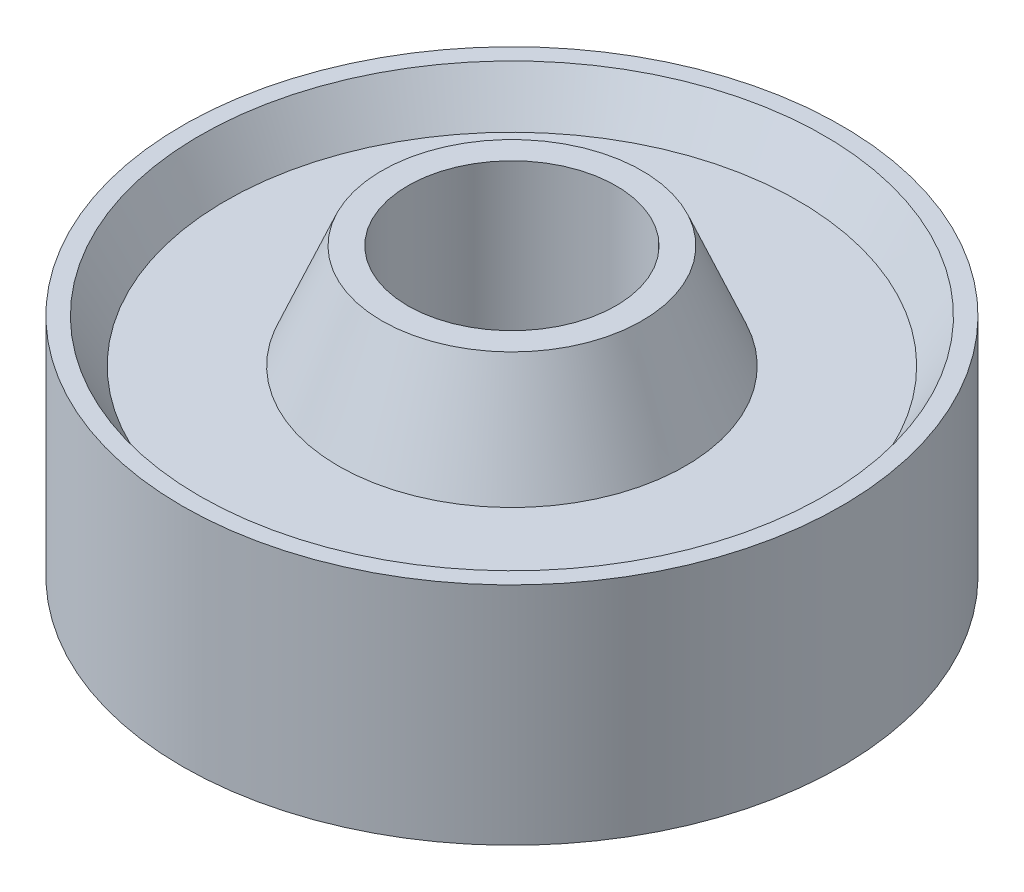
ISO-10303-21;
HEADER;
FILE_DESCRIPTION(('STEP AP214'),'2;1');
FILE_NAME('part.step','',(''),(''),'','','');
FILE_SCHEMA(('AUTOMOTIVE_DESIGN { 1 0 10303 214 1 1 1 1 }'));
ENDSEC;
DATA;
#1=APPLICATION_CONTEXT('core data for automotive mechanical design processes');
#2=APPLICATION_PROTOCOL_DEFINITION('international standard','automotive_design',2000,#1);
#3=PRODUCT_CONTEXT('',#1,'mechanical');
#4=PRODUCT('Part','Part','',(#3));
#5=PRODUCT_RELATED_PRODUCT_CATEGORY('part','',(#4));
#6=PRODUCT_DEFINITION_FORMATION('','',#4);
#7=PRODUCT_DEFINITION_CONTEXT('part definition',#1,'design');
#8=PRODUCT_DEFINITION('design','',#6,#7);
#9=PRODUCT_DEFINITION_SHAPE('','',#8);
#10=(LENGTH_UNIT() NAMED_UNIT(*) SI_UNIT(.MILLI.,.METRE.));
#11=(NAMED_UNIT(*) PLANE_ANGLE_UNIT() SI_UNIT($,.RADIAN.));
#12=(NAMED_UNIT(*) SI_UNIT($,.STERADIAN.) SOLID_ANGLE_UNIT());
#13=UNCERTAINTY_MEASURE_WITH_UNIT(LENGTH_MEASURE(1.E-05),#10,'distance_accuracy_value','');
#14=(GEOMETRIC_REPRESENTATION_CONTEXT(3) GLOBAL_UNCERTAINTY_ASSIGNED_CONTEXT((#13)) GLOBAL_UNIT_ASSIGNED_CONTEXT((#10,
#11,#12)) REPRESENTATION_CONTEXT('',''));
#15=CARTESIAN_POINT('',(0.,0.,0.));
#16=DIRECTION('',(0.,0.,1.));
#17=DIRECTION('',(1.,0.,0.));
#18=AXIS2_PLACEMENT_3D('',#15,#16,#17);
#19=CARTESIAN_POINT('',(0.,-20.,0.));
#20=DIRECTION('',(0.,1.,0.));
#21=DIRECTION('',(0.,0.,1.));
#22=AXIS2_PLACEMENT_3D('',#19,#20,#21);
#23=PLANE('',#22);
#24=CARTESIAN_POINT('',(0.,-20.,0.));
#25=DIRECTION('',(0.,1.,0.));
#26=DIRECTION('',(0.,0.,1.));
#27=AXIS2_PLACEMENT_3D('',#24,#25,#26);
#28=CIRCLE('',#27,12.);
#29=CARTESIAN_POINT('',(0.,-20.,12.));
#30=VERTEX_POINT('',#29);
#31=EDGE_CURVE('E88',#30,#30,#28,.T.);
#32=ORIENTED_EDGE('',*,*,#31,.T.);
#33=EDGE_LOOP('',(#32));
#34=FACE_BOUND('',#33,.T.);
#35=CARTESIAN_POINT('',(0.,-20.,0.));
#36=DIRECTION('',(0.,1.,0.));
#37=DIRECTION('',(0.,0.,1.));
#38=AXIS2_PLACEMENT_3D('',#35,#36,#37);
#39=CIRCLE('',#38,15.);
#40=CARTESIAN_POINT('',(0.,-20.,15.));
#41=VERTEX_POINT('',#40);
#42=EDGE_CURVE('E10',#41,#41,#39,.T.);
#43=ORIENTED_EDGE('',*,*,#42,.F.);
#44=EDGE_LOOP('',(#43));
#45=FACE_BOUND('',#44,.T.);
#46=ADVANCED_FACE('F41',(#34,#45),#23,.F.);
#47=CARTESIAN_POINT('',(0.,-20.,0.));
#48=DIRECTION('',(0.,1.,0.));
#49=DIRECTION('',(0.,0.,1.));
#50=AXIS2_PLACEMENT_3D('',#47,#48,#49);
#51=CONICAL_SURFACE('',#50,15.,0.394791119699761);
#52=CARTESIAN_POINT('',(0.,-8.,0.));
#53=DIRECTION('',(0.,1.,0.));
#54=DIRECTION('',(0.,0.,1.));
#55=AXIS2_PLACEMENT_3D('',#52,#53,#54);
#56=CIRCLE('',#55,20.);
#57=CARTESIAN_POINT('',(0.,-8.,20.));
#58=VERTEX_POINT('',#57);
#59=EDGE_CURVE('E48',#58,#58,#56,.T.);
#60=ORIENTED_EDGE('',*,*,#59,.F.);
#61=EDGE_LOOP('',(#60));
#62=FACE_BOUND('',#61,.T.);
#63=ORIENTED_EDGE('',*,*,#42,.T.);
#64=EDGE_LOOP('',(#63));
#65=FACE_BOUND('',#64,.T.);
#66=ADVANCED_FACE('F155',(#62,#65),#51,.T.);
#67=CARTESIAN_POINT('',(20.,-8.,0.));
#68=DIRECTION('',(0.,1.,0.));
#69=DIRECTION('',(0.,0.,1.));
#70=AXIS2_PLACEMENT_3D('',#67,#68,#69);
#71=PLANE('',#70);
#72=CARTESIAN_POINT('',(0.,-8.,0.));
#73=DIRECTION('',(0.,1.,0.));
#74=DIRECTION('',(0.,0.,1.));
#75=AXIS2_PLACEMENT_3D('',#72,#73,#74);
#76=CIRCLE('',#75,33.);
#77=CARTESIAN_POINT('',(0.,-8.,33.));
#78=VERTEX_POINT('',#77);
#79=EDGE_CURVE('E53',#78,#78,#76,.T.);
#80=ORIENTED_EDGE('',*,*,#79,.F.);
#81=EDGE_LOOP('',(#80));
#82=FACE_BOUND('',#81,.T.);
#83=ORIENTED_EDGE('',*,*,#59,.T.);
#84=EDGE_LOOP('',(#83));
#85=FACE_BOUND('',#84,.T.);
#86=ADVANCED_FACE('F150',(#82,#85),#71,.F.);
#87=CARTESIAN_POINT('',(0.,-8.,0.));
#88=DIRECTION('',(0.,-1.,0.));
#89=DIRECTION('',(0.,0.,-1.));
#90=AXIS2_PLACEMENT_3D('',#87,#88,#89);
#91=CONICAL_SURFACE('',#90,33.,0.540419500270584);
#92=CARTESIAN_POINT('',(0.,-13.,0.));
#93=DIRECTION('',(0.,1.,0.));
#94=DIRECTION('',(0.,0.,1.));
#95=AXIS2_PLACEMENT_3D('',#92,#93,#94);
#96=CIRCLE('',#95,36.);
#97=CARTESIAN_POINT('',(0.,-13.,36.));
#98=VERTEX_POINT('',#97);
#99=EDGE_CURVE('E58',#98,#98,#96,.T.);
#100=ORIENTED_EDGE('',*,*,#99,.F.);
#101=EDGE_LOOP('',(#100));
#102=FACE_BOUND('',#101,.T.);
#103=ORIENTED_EDGE('',*,*,#79,.T.);
#104=EDGE_LOOP('',(#103));
#105=FACE_BOUND('',#104,.T.);
#106=ADVANCED_FACE('F144',(#102,#105),#91,.F.);
#107=CARTESIAN_POINT('',(36.,-13.,0.));
#108=DIRECTION('',(0.,1.,0.));
#109=DIRECTION('',(0.,0.,1.));
#110=AXIS2_PLACEMENT_3D('',#107,#108,#109);
#111=PLANE('',#110);
#112=CARTESIAN_POINT('',(0.,-13.,0.));
#113=DIRECTION('',(0.,1.,0.));
#114=DIRECTION('',(0.,0.,1.));
#115=AXIS2_PLACEMENT_3D('',#112,#113,#114);
#116=CIRCLE('',#115,38.);
#117=CARTESIAN_POINT('',(0.,-13.,38.));
#118=VERTEX_POINT('',#117);
#119=EDGE_CURVE('E64',#118,#118,#116,.T.);
#120=ORIENTED_EDGE('',*,*,#119,.F.);
#121=EDGE_LOOP('',(#120));
#122=FACE_BOUND('',#121,.T.);
#123=ORIENTED_EDGE('',*,*,#99,.T.);
#124=EDGE_LOOP('',(#123));
#125=FACE_BOUND('',#124,.T.);
#126=ADVANCED_FACE('F138',(#122,#125),#111,.F.);
#127=CARTESIAN_POINT('',(0.,20.,0.));
#128=DIRECTION('',(0.,1.,0.));
#129=DIRECTION('',(0.,0.,1.));
#130=AXIS2_PLACEMENT_3D('',#127,#128,#129);
#131=CYLINDRICAL_SURFACE('',#130,38.);
#132=CARTESIAN_POINT('',(0.,13.,0.));
#133=DIRECTION('',(0.,1.,0.));
#134=DIRECTION('',(0.,0.,1.));
#135=AXIS2_PLACEMENT_3D('',#132,#133,#134);
#136=CIRCLE('',#135,38.);
#137=CARTESIAN_POINT('',(0.,13.,38.));
#138=VERTEX_POINT('',#137);
#139=EDGE_CURVE('E68',#138,#138,#136,.T.);
#140=ORIENTED_EDGE('',*,*,#139,.F.);
#141=EDGE_LOOP('',(#140));
#142=FACE_BOUND('',#141,.T.);
#143=ORIENTED_EDGE('',*,*,#119,.T.);
#144=EDGE_LOOP('',(#143));
#145=FACE_BOUND('',#144,.T.);
#146=ADVANCED_FACE('F132',(#142,#145),#131,.T.);
#147=CARTESIAN_POINT('',(36.,13.,0.));
#148=DIRECTION('',(0.,-1.,0.));
#149=DIRECTION('',(0.,0.,-1.));
#150=AXIS2_PLACEMENT_3D('',#147,#148,#149);
#151=PLANE('',#150);
#152=CARTESIAN_POINT('',(0.,13.,0.));
#153=DIRECTION('',(0.,1.,0.));
#154=DIRECTION('',(0.,0.,1.));
#155=AXIS2_PLACEMENT_3D('',#152,#153,#154);
#156=CIRCLE('',#155,36.);
#157=CARTESIAN_POINT('',(0.,13.,36.));
#158=VERTEX_POINT('',#157);
#159=EDGE_CURVE('E72',#158,#158,#156,.T.);
#160=ORIENTED_EDGE('',*,*,#159,.F.);
#161=EDGE_LOOP('',(#160));
#162=FACE_BOUND('',#161,.T.);
#163=ORIENTED_EDGE('',*,*,#139,.T.);
#164=EDGE_LOOP('',(#163));
#165=FACE_BOUND('',#164,.T.);
#166=ADVANCED_FACE('F126',(#162,#165),#151,.F.);
#167=CARTESIAN_POINT('',(0.,13.,0.));
#168=DIRECTION('',(0.,1.,0.));
#169=DIRECTION('',(0.,0.,1.));
#170=AXIS2_PLACEMENT_3D('',#167,#168,#169);
#171=CONICAL_SURFACE('',#170,36.,0.540419500270585);
#172=CARTESIAN_POINT('',(0.,8.,0.));
#173=DIRECTION('',(0.,1.,0.));
#174=DIRECTION('',(0.,0.,1.));
#175=AXIS2_PLACEMENT_3D('',#172,#173,#174);
#176=CIRCLE('',#175,33.);
#177=CARTESIAN_POINT('',(0.,8.,33.));
#178=VERTEX_POINT('',#177);
#179=EDGE_CURVE('E76',#178,#178,#176,.T.);
#180=ORIENTED_EDGE('',*,*,#179,.F.);
#181=EDGE_LOOP('',(#180));
#182=FACE_BOUND('',#181,.T.);
#183=ORIENTED_EDGE('',*,*,#159,.T.);
#184=EDGE_LOOP('',(#183));
#185=FACE_BOUND('',#184,.T.);
#186=ADVANCED_FACE('F120',(#182,#185),#171,.F.);
#187=CARTESIAN_POINT('',(20.,8.,0.));
#188=DIRECTION('',(0.,-1.,0.));
#189=DIRECTION('',(0.,0.,-1.));
#190=AXIS2_PLACEMENT_3D('',#187,#188,#189);
#191=PLANE('',#190);
#192=CARTESIAN_POINT('',(0.,8.,0.));
#193=DIRECTION('',(0.,1.,0.));
#194=DIRECTION('',(0.,0.,1.));
#195=AXIS2_PLACEMENT_3D('',#192,#193,#194);
#196=CIRCLE('',#195,20.);
#197=CARTESIAN_POINT('',(0.,8.,20.));
#198=VERTEX_POINT('',#197);
#199=EDGE_CURVE('E80',#198,#198,#196,.T.);
#200=ORIENTED_EDGE('',*,*,#199,.F.);
#201=EDGE_LOOP('',(#200));
#202=FACE_BOUND('',#201,.T.);
#203=ORIENTED_EDGE('',*,*,#179,.T.);
#204=EDGE_LOOP('',(#203));
#205=FACE_BOUND('',#204,.T.);
#206=ADVANCED_FACE('F114',(#202,#205),#191,.F.);
#207=CARTESIAN_POINT('',(0.,8.,0.));
#208=DIRECTION('',(0.,-1.,0.));
#209=DIRECTION('',(0.,0.,-1.));
#210=AXIS2_PLACEMENT_3D('',#207,#208,#209);
#211=CONICAL_SURFACE('',#210,20.,0.394791119699761);
#212=CARTESIAN_POINT('',(0.,20.,0.));
#213=DIRECTION('',(0.,1.,0.));
#214=DIRECTION('',(0.,0.,1.));
#215=AXIS2_PLACEMENT_3D('',#212,#213,#214);
#216=CIRCLE('',#215,15.);
#217=CARTESIAN_POINT('',(0.,20.,15.));
#218=VERTEX_POINT('',#217);
#219=EDGE_CURVE('E84',#218,#218,#216,.T.);
#220=ORIENTED_EDGE('',*,*,#219,.F.);
#221=EDGE_LOOP('',(#220));
#222=FACE_BOUND('',#221,.T.);
#223=ORIENTED_EDGE('',*,*,#199,.T.);
#224=EDGE_LOOP('',(#223));
#225=FACE_BOUND('',#224,.T.);
#226=ADVANCED_FACE('F108',(#222,#225),#211,.T.);
#227=CARTESIAN_POINT('',(0.,20.,0.));
#228=DIRECTION('',(0.,-1.,0.));
#229=DIRECTION('',(0.,0.,-1.));
#230=AXIS2_PLACEMENT_3D('',#227,#228,#229);
#231=PLANE('',#230);
#232=CARTESIAN_POINT('',(0.,20.,0.));
#233=DIRECTION('',(0.,1.,0.));
#234=DIRECTION('',(0.,0.,1.));
#235=AXIS2_PLACEMENT_3D('',#232,#233,#234);
#236=CIRCLE('',#235,12.);
#237=CARTESIAN_POINT('',(0.,20.,12.));
#238=VERTEX_POINT('',#237);
#239=EDGE_CURVE('E89',#238,#238,#236,.T.);
#240=ORIENTED_EDGE('',*,*,#239,.F.);
#241=EDGE_LOOP('',(#240));
#242=FACE_BOUND('',#241,.T.);
#243=ORIENTED_EDGE('',*,*,#219,.T.);
#244=EDGE_LOOP('',(#243));
#245=FACE_BOUND('',#244,.T.);
#246=ADVANCED_FACE('F102',(#242,#245),#231,.F.);
#247=CARTESIAN_POINT('',(0.,-20.,0.));
#248=DIRECTION('',(0.,1.,0.));
#249=DIRECTION('',(0.,0.,1.));
#250=AXIS2_PLACEMENT_3D('',#247,#248,#249);
#251=CYLINDRICAL_SURFACE('',#250,12.);
#252=ORIENTED_EDGE('',*,*,#31,.F.);
#253=EDGE_LOOP('',(#252));
#254=FACE_BOUND('',#253,.T.);
#255=ORIENTED_EDGE('',*,*,#239,.T.);
#256=EDGE_LOOP('',(#255));
#257=FACE_BOUND('',#256,.T.);
#258=ADVANCED_FACE('F99',(#254,#257),#251,.F.);
#259=CLOSED_SHELL('',(#46,#66,#86,#106,#126,#146,#166,#186,#206,#226,#246,#258));
#260=MANIFOLD_SOLID_BREP('B2',#259);
#261=ADVANCED_BREP_SHAPE_REPRESENTATION('',(#18,#260),#14);
#262=SHAPE_DEFINITION_REPRESENTATION(#9,#261);
ENDSEC;
END-ISO-10303-21;
